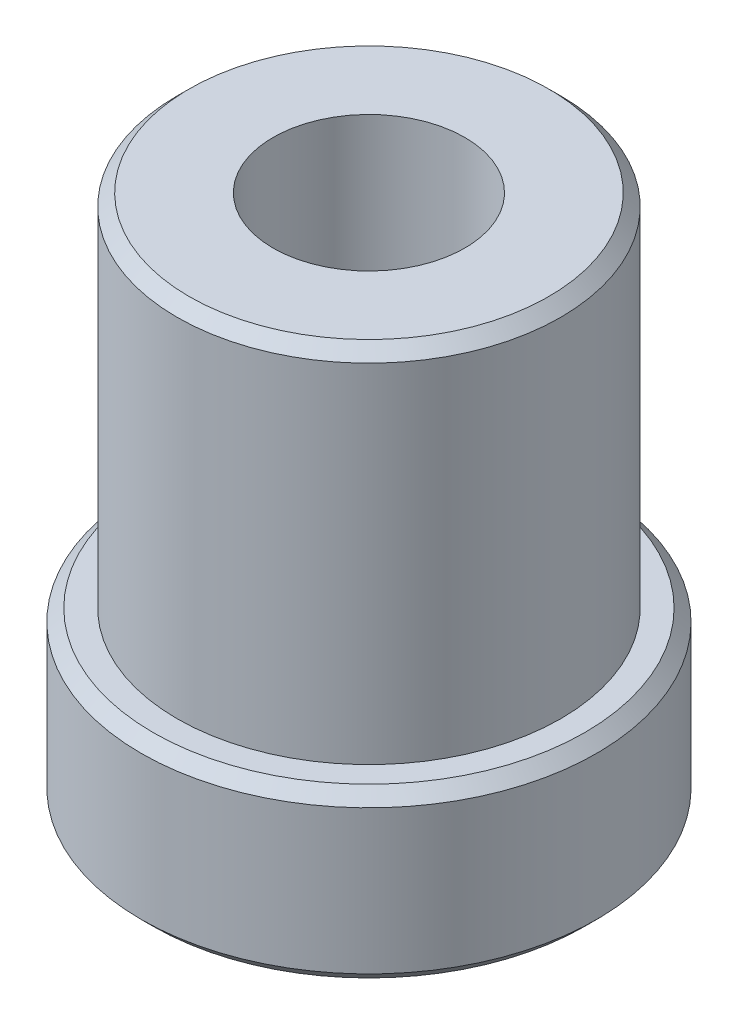
ISO-10303-21;
HEADER;
FILE_DESCRIPTION(('STEP AP214'),'2;1');
FILE_NAME('part.step','',(''),(''),'','','');
FILE_SCHEMA(('AUTOMOTIVE_DESIGN { 1 0 10303 214 1 1 1 1 }'));
ENDSEC;
DATA;
#1=APPLICATION_CONTEXT('core data for automotive mechanical design processes');
#2=APPLICATION_PROTOCOL_DEFINITION('international standard','automotive_design',2000,#1);
#3=PRODUCT_CONTEXT('',#1,'mechanical');
#4=PRODUCT('Part','Part','',(#3));
#5=PRODUCT_RELATED_PRODUCT_CATEGORY('part','',(#4));
#6=PRODUCT_DEFINITION_FORMATION('','',#4);
#7=PRODUCT_DEFINITION_CONTEXT('part definition',#1,'design');
#8=PRODUCT_DEFINITION('design','',#6,#7);
#9=PRODUCT_DEFINITION_SHAPE('','',#8);
#10=(LENGTH_UNIT() NAMED_UNIT(*) SI_UNIT(.MILLI.,.METRE.));
#11=(NAMED_UNIT(*) PLANE_ANGLE_UNIT() SI_UNIT($,.RADIAN.));
#12=(NAMED_UNIT(*) SI_UNIT($,.STERADIAN.) SOLID_ANGLE_UNIT());
#13=UNCERTAINTY_MEASURE_WITH_UNIT(LENGTH_MEASURE(1.E-05),#10,'distance_accuracy_value','');
#14=(GEOMETRIC_REPRESENTATION_CONTEXT(3) GLOBAL_UNCERTAINTY_ASSIGNED_CONTEXT((#13)) GLOBAL_UNIT_ASSIGNED_CONTEXT((#10,
#11,#12)) REPRESENTATION_CONTEXT('',''));
#15=CARTESIAN_POINT('',(0.,0.,0.));
#16=DIRECTION('',(0.,0.,1.));
#17=DIRECTION('',(1.,0.,0.));
#18=AXIS2_PLACEMENT_3D('',#15,#16,#17);
#19=CARTESIAN_POINT('',(0.,7.,0.));
#20=DIRECTION('',(0.,-1.,0.));
#21=DIRECTION('',(0.,0.,-1.));
#22=AXIS2_PLACEMENT_3D('',#19,#20,#21);
#23=CYLINDRICAL_SURFACE('',#22,9.5);
#24=CARTESIAN_POINT('',(0.,0.5,0.));
#25=DIRECTION('',(0.,1.,0.));
#26=DIRECTION('',(0.,0.,1.));
#27=AXIS2_PLACEMENT_3D('',#24,#25,#26);
#28=CIRCLE('',#27,9.5);
#29=CARTESIAN_POINT('',(0.,0.5,9.5));
#30=VERTEX_POINT('',#29);
#31=EDGE_CURVE('E68',#30,#30,#28,.T.);
#32=ORIENTED_EDGE('',*,*,#31,.T.);
#33=EDGE_LOOP('',(#32));
#34=FACE_BOUND('',#33,.T.);
#35=CARTESIAN_POINT('',(0.,6.50000000000001,0.));
#36=DIRECTION('',(0.,1.,0.));
#37=DIRECTION('',(0.,0.,1.));
#38=AXIS2_PLACEMENT_3D('',#35,#36,#37);
#39=CIRCLE('',#38,9.5);
#40=CARTESIAN_POINT('',(0.,6.50000000000001,9.5));
#41=VERTEX_POINT('',#40);
#42=EDGE_CURVE('E72',#41,#41,#39,.F.);
#43=ORIENTED_EDGE('',*,*,#42,.T.);
#44=EDGE_LOOP('',(#43));
#45=FACE_BOUND('',#44,.T.);
#46=ADVANCED_FACE('F43',(#34,#45),#23,.T.);
#47=CARTESIAN_POINT('',(0.,7.,0.));
#48=DIRECTION('',(0.,1.,0.));
#49=DIRECTION('',(0.,0.,1.));
#50=AXIS2_PLACEMENT_3D('',#47,#48,#49);
#51=PLANE('',#50);
#52=CARTESIAN_POINT('',(0.,7.,0.));
#53=DIRECTION('',(0.,1.,0.));
#54=DIRECTION('',(0.,0.,1.));
#55=AXIS2_PLACEMENT_3D('',#52,#53,#54);
#56=CIRCLE('',#55,9.00000000000001);
#57=CARTESIAN_POINT('',(0.,7.,9.00000000000001));
#58=VERTEX_POINT('',#57);
#59=EDGE_CURVE('E57',#58,#58,#56,.T.);
#60=ORIENTED_EDGE('',*,*,#59,.T.);
#61=EDGE_LOOP('',(#60));
#62=FACE_BOUND('',#61,.T.);
#63=CARTESIAN_POINT('',(0.,7.,0.));
#64=DIRECTION('',(0.,1.,0.));
#65=DIRECTION('',(0.,0.,1.));
#66=AXIS2_PLACEMENT_3D('',#63,#64,#65);
#67=CIRCLE('',#66,8.);
#68=CARTESIAN_POINT('',(0.,7.,8.));
#69=VERTEX_POINT('',#68);
#70=EDGE_CURVE('E76',#69,#69,#67,.T.);
#71=ORIENTED_EDGE('',*,*,#70,.F.);
#72=EDGE_LOOP('',(#71));
#73=FACE_BOUND('',#72,.T.);
#74=ADVANCED_FACE('F107',(#62,#73),#51,.T.);
#75=CARTESIAN_POINT('',(0.,0.,0.));
#76=DIRECTION('',(0.,1.,0.));
#77=DIRECTION('',(0.,0.,1.));
#78=AXIS2_PLACEMENT_3D('',#75,#76,#77);
#79=PLANE('',#78);
#80=CARTESIAN_POINT('',(0.,0.,0.));
#81=DIRECTION('',(0.,1.,0.));
#82=DIRECTION('',(0.,0.,1.));
#83=AXIS2_PLACEMENT_3D('',#80,#81,#82);
#84=CIRCLE('',#83,9.);
#85=CARTESIAN_POINT('',(0.,0.,9.));
#86=VERTEX_POINT('',#85);
#87=EDGE_CURVE('E62',#86,#86,#84,.F.);
#88=ORIENTED_EDGE('',*,*,#87,.T.);
#89=EDGE_LOOP('',(#88));
#90=FACE_BOUND('',#89,.T.);
#91=CARTESIAN_POINT('',(0.,0.,0.));
#92=DIRECTION('',(0.,1.,0.));
#93=DIRECTION('',(0.,0.,1.));
#94=AXIS2_PLACEMENT_3D('',#91,#92,#93);
#95=CIRCLE('',#94,4.);
#96=CARTESIAN_POINT('',(0.,0.,4.));
#97=VERTEX_POINT('',#96);
#98=EDGE_CURVE('E80',#97,#97,#95,.T.);
#99=ORIENTED_EDGE('',*,*,#98,.T.);
#100=EDGE_LOOP('',(#99));
#101=FACE_BOUND('',#100,.T.);
#102=ADVANCED_FACE('F89',(#90,#101),#79,.F.);
#103=CARTESIAN_POINT('',(0.,22.,0.));
#104=DIRECTION('',(0.,-1.,0.));
#105=DIRECTION('',(0.,0.,-1.));
#106=AXIS2_PLACEMENT_3D('',#103,#104,#105);
#107=CYLINDRICAL_SURFACE('',#106,8.);
#108=CARTESIAN_POINT('',(0.,21.5,0.));
#109=DIRECTION('',(0.,1.,0.));
#110=DIRECTION('',(0.,0.,1.));
#111=AXIS2_PLACEMENT_3D('',#108,#109,#110);
#112=CIRCLE('',#111,8.);
#113=CARTESIAN_POINT('',(0.,21.5,8.));
#114=VERTEX_POINT('',#113);
#115=EDGE_CURVE('E10',#114,#114,#112,.F.);
#116=ORIENTED_EDGE('',*,*,#115,.T.);
#117=EDGE_LOOP('',(#116));
#118=FACE_BOUND('',#117,.T.);
#119=ORIENTED_EDGE('',*,*,#70,.T.);
#120=EDGE_LOOP('',(#119));
#121=FACE_BOUND('',#120,.T.);
#122=ADVANCED_FACE('F100',(#118,#121),#107,.T.);
#123=CARTESIAN_POINT('',(0.,22.,0.));
#124=DIRECTION('',(0.,1.,0.));
#125=DIRECTION('',(0.,0.,1.));
#126=AXIS2_PLACEMENT_3D('',#123,#124,#125);
#127=PLANE('',#126);
#128=CARTESIAN_POINT('',(0.,22.,0.));
#129=DIRECTION('',(0.,1.,0.));
#130=DIRECTION('',(0.,0.,1.));
#131=AXIS2_PLACEMENT_3D('',#128,#129,#130);
#132=CIRCLE('',#131,7.50000000000001);
#133=CARTESIAN_POINT('',(0.,22.,7.50000000000001));
#134=VERTEX_POINT('',#133);
#135=EDGE_CURVE('E52',#134,#134,#132,.T.);
#136=ORIENTED_EDGE('',*,*,#135,.T.);
#137=EDGE_LOOP('',(#136));
#138=FACE_BOUND('',#137,.T.);
#139=CARTESIAN_POINT('',(0.,22.,0.));
#140=DIRECTION('',(0.,1.,0.));
#141=DIRECTION('',(0.,0.,1.));
#142=AXIS2_PLACEMENT_3D('',#139,#140,#141);
#143=CIRCLE('',#142,4.);
#144=CARTESIAN_POINT('',(0.,22.,4.));
#145=VERTEX_POINT('',#144);
#146=EDGE_CURVE('E81',#145,#145,#143,.T.);
#147=ORIENTED_EDGE('',*,*,#146,.F.);
#148=EDGE_LOOP('',(#147));
#149=FACE_BOUND('',#148,.T.);
#150=ADVANCED_FACE('F95',(#138,#149),#127,.T.);
#151=CARTESIAN_POINT('',(0.,0.,0.));
#152=DIRECTION('',(0.,1.,0.));
#153=DIRECTION('',(0.,0.,1.));
#154=AXIS2_PLACEMENT_3D('',#151,#152,#153);
#155=CYLINDRICAL_SURFACE('',#154,4.);
#156=ORIENTED_EDGE('',*,*,#98,.F.);
#157=EDGE_LOOP('',(#156));
#158=FACE_BOUND('',#157,.T.);
#159=ORIENTED_EDGE('',*,*,#146,.T.);
#160=EDGE_LOOP('',(#159));
#161=FACE_BOUND('',#160,.T.);
#162=ADVANCED_FACE('F91',(#158,#161),#155,.F.);
#163=CARTESIAN_POINT('',(0.,0.5,0.));
#164=DIRECTION('',(0.,1.,0.));
#165=DIRECTION('',(0.,0.,1.));
#166=AXIS2_PLACEMENT_3D('',#163,#164,#165);
#167=CONICAL_SURFACE('',#166,9.5,0.785398163397452);
#168=ORIENTED_EDGE('',*,*,#87,.F.);
#169=EDGE_LOOP('',(#168));
#170=FACE_BOUND('',#169,.T.);
#171=ORIENTED_EDGE('',*,*,#31,.F.);
#172=EDGE_LOOP('',(#171));
#173=FACE_BOUND('',#172,.T.);
#174=ADVANCED_FACE('F94',(#170,#173),#167,.T.);
#175=CARTESIAN_POINT('',(0.,7.,0.));
#176=DIRECTION('',(0.,-1.,0.));
#177=DIRECTION('',(0.,0.,-1.));
#178=AXIS2_PLACEMENT_3D('',#175,#176,#177);
#179=CONICAL_SURFACE('',#178,9.00000000000001,0.78539816339745);
#180=ORIENTED_EDGE('',*,*,#42,.F.);
#181=EDGE_LOOP('',(#180));
#182=FACE_BOUND('',#181,.T.);
#183=ORIENTED_EDGE('',*,*,#59,.F.);
#184=EDGE_LOOP('',(#183));
#185=FACE_BOUND('',#184,.T.);
#186=ADVANCED_FACE('F123',(#182,#185),#179,.T.);
#187=CARTESIAN_POINT('',(0.,22.,0.));
#188=DIRECTION('',(0.,-1.,0.));
#189=DIRECTION('',(0.,0.,-1.));
#190=AXIS2_PLACEMENT_3D('',#187,#188,#189);
#191=CONICAL_SURFACE('',#190,7.50000000000001,0.785398163397448);
#192=ORIENTED_EDGE('',*,*,#115,.F.);
#193=EDGE_LOOP('',(#192));
#194=FACE_BOUND('',#193,.T.);
#195=ORIENTED_EDGE('',*,*,#135,.F.);
#196=EDGE_LOOP('',(#195));
#197=FACE_BOUND('',#196,.T.);
#198=ADVANCED_FACE('F46',(#194,#197),#191,.T.);
#199=CLOSED_SHELL('',(#46,#74,#102,#122,#150,#162,#174,#186,#198));
#200=MANIFOLD_SOLID_BREP('B2',#199);
#201=ADVANCED_BREP_SHAPE_REPRESENTATION('',(#18,#200),#14);
#202=SHAPE_DEFINITION_REPRESENTATION(#9,#201);
ENDSEC;
END-ISO-10303-21;
